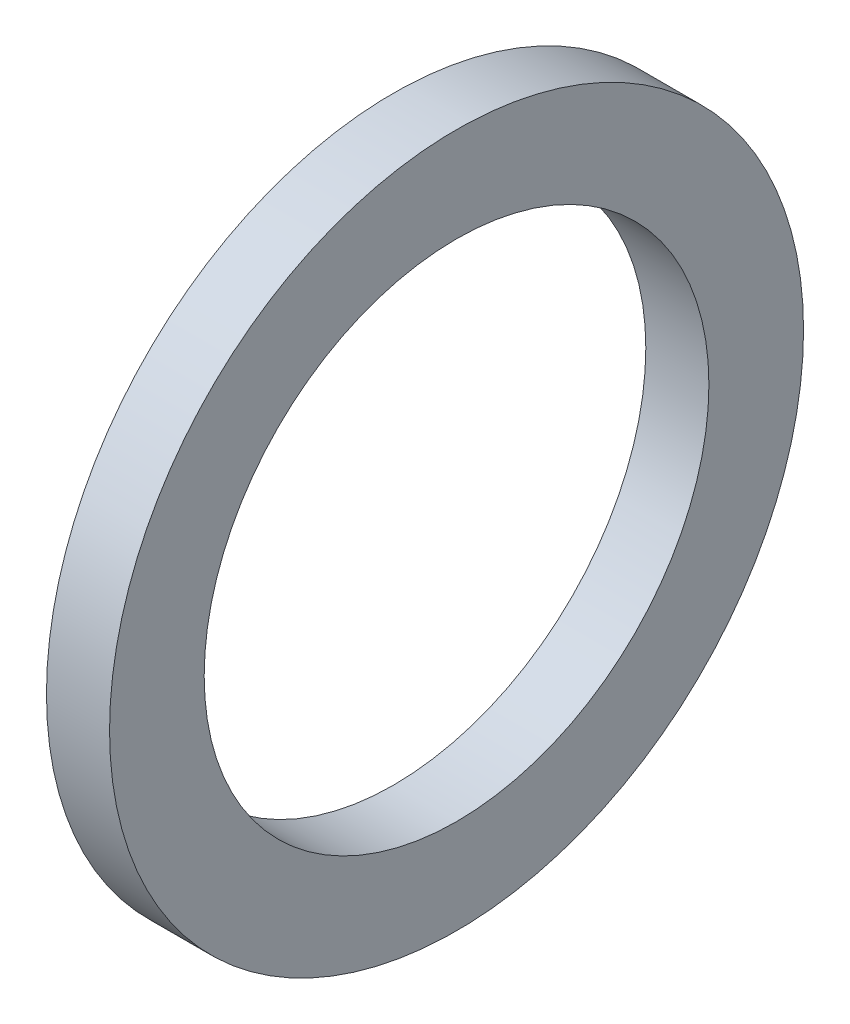
ISO-10303-21;
HEADER;
FILE_DESCRIPTION(('STEP AP214'),'2;1');
FILE_NAME('part.step','',(''),(''),'','','');
FILE_SCHEMA(('AUTOMOTIVE_DESIGN { 1 0 10303 214 1 1 1 1 }'));
ENDSEC;
DATA;
#1=APPLICATION_CONTEXT('core data for automotive mechanical design processes');
#2=APPLICATION_PROTOCOL_DEFINITION('international standard','automotive_design',2000,#1);
#3=PRODUCT_CONTEXT('',#1,'mechanical');
#4=PRODUCT('Part','Part','',(#3));
#5=PRODUCT_RELATED_PRODUCT_CATEGORY('part','',(#4));
#6=PRODUCT_DEFINITION_FORMATION('','',#4);
#7=PRODUCT_DEFINITION_CONTEXT('part definition',#1,'design');
#8=PRODUCT_DEFINITION('design','',#6,#7);
#9=PRODUCT_DEFINITION_SHAPE('','',#8);
#10=(LENGTH_UNIT() NAMED_UNIT(*) SI_UNIT(.MILLI.,.METRE.));
#11=(NAMED_UNIT(*) PLANE_ANGLE_UNIT() SI_UNIT($,.RADIAN.));
#12=(NAMED_UNIT(*) SI_UNIT($,.STERADIAN.) SOLID_ANGLE_UNIT());
#13=UNCERTAINTY_MEASURE_WITH_UNIT(LENGTH_MEASURE(1.E-05),#10,'distance_accuracy_value','');
#14=(GEOMETRIC_REPRESENTATION_CONTEXT(3) GLOBAL_UNCERTAINTY_ASSIGNED_CONTEXT((#13)) GLOBAL_UNIT_ASSIGNED_CONTEXT((#10,
#11,#12)) REPRESENTATION_CONTEXT('',''));
#15=CARTESIAN_POINT('',(0.,0.,0.));
#16=DIRECTION('',(0.,0.,1.));
#17=DIRECTION('',(1.,0.,0.));
#18=AXIS2_PLACEMENT_3D('',#15,#16,#17);
#19=CARTESIAN_POINT('',(-15.4432,0.,-221.533693244064));
#20=DIRECTION('',(-1.,0.,0.));
#21=DIRECTION('',(0.,0.,1.));
#22=AXIS2_PLACEMENT_3D('',#19,#20,#21);
#23=PLANE('',#22);
#24=CARTESIAN_POINT('',(-15.4432,0.,-221.533693244064));
#25=DIRECTION('',(-1.,0.,0.));
#26=DIRECTION('',(0.,0.,1.));
#27=AXIS2_PLACEMENT_3D('',#24,#25,#26);
#28=CIRCLE('',#27,17.4625);
#29=CARTESIAN_POINT('',(-15.4432,0.,-204.071193244064));
#30=VERTEX_POINT('',#29);
#31=EDGE_CURVE('E10',#30,#30,#28,.T.);
#32=ORIENTED_EDGE('',*,*,#31,.T.);
#33=EDGE_LOOP('',(#32));
#34=FACE_BOUND('',#33,.T.);
#35=CARTESIAN_POINT('',(-15.4432,0.,-221.533693244064));
#36=DIRECTION('',(-1.,0.,0.));
#37=DIRECTION('',(0.,0.,1.));
#38=AXIS2_PLACEMENT_3D('',#35,#36,#37);
#39=CIRCLE('',#38,12.7);
#40=CARTESIAN_POINT('',(-15.4432,0.,-208.833693244064));
#41=VERTEX_POINT('',#40);
#42=EDGE_CURVE('E48',#41,#41,#39,.T.);
#43=ORIENTED_EDGE('',*,*,#42,.F.);
#44=EDGE_LOOP('',(#43));
#45=FACE_BOUND('',#44,.T.);
#46=ADVANCED_FACE('F37',(#34,#45),#23,.T.);
#47=CARTESIAN_POINT('',(-12.2682,0.,-221.533693244064));
#48=DIRECTION('',(-1.,0.,0.));
#49=DIRECTION('',(0.,0.,1.));
#50=AXIS2_PLACEMENT_3D('',#47,#48,#49);
#51=PLANE('',#50);
#52=CARTESIAN_POINT('',(-12.2682,0.,-221.533693244064));
#53=DIRECTION('',(-1.,0.,0.));
#54=DIRECTION('',(0.,0.,1.));
#55=AXIS2_PLACEMENT_3D('',#52,#53,#54);
#56=CIRCLE('',#55,17.4625);
#57=CARTESIAN_POINT('',(-12.2682,0.,-204.071193244064));
#58=VERTEX_POINT('',#57);
#59=EDGE_CURVE('E41',#58,#58,#56,.T.);
#60=ORIENTED_EDGE('',*,*,#59,.F.);
#61=EDGE_LOOP('',(#60));
#62=FACE_BOUND('',#61,.T.);
#63=CARTESIAN_POINT('',(-12.2682,0.,-221.533693244064));
#64=DIRECTION('',(-1.,0.,0.));
#65=DIRECTION('',(0.,0.,1.));
#66=AXIS2_PLACEMENT_3D('',#63,#64,#65);
#67=CIRCLE('',#66,12.7);
#68=CARTESIAN_POINT('',(-12.2682,0.,-208.833693244064));
#69=VERTEX_POINT('',#68);
#70=EDGE_CURVE('E50',#69,#69,#67,.T.);
#71=ORIENTED_EDGE('',*,*,#70,.T.);
#72=EDGE_LOOP('',(#71));
#73=FACE_BOUND('',#72,.T.);
#74=ADVANCED_FACE('F60',(#62,#73),#51,.F.);
#75=CARTESIAN_POINT('',(-15.4432,0.,-221.533693244064));
#76=DIRECTION('',(1.,0.,0.));
#77=DIRECTION('',(0.,0.,-1.));
#78=AXIS2_PLACEMENT_3D('',#75,#76,#77);
#79=CYLINDRICAL_SURFACE('',#78,17.4625);
#80=ORIENTED_EDGE('',*,*,#31,.F.);
#81=EDGE_LOOP('',(#80));
#82=FACE_BOUND('',#81,.T.);
#83=ORIENTED_EDGE('',*,*,#59,.T.);
#84=EDGE_LOOP('',(#83));
#85=FACE_BOUND('',#84,.T.);
#86=ADVANCED_FACE('F39',(#82,#85),#79,.T.);
#87=CARTESIAN_POINT('',(-15.4432,0.,-221.533693244064));
#88=DIRECTION('',(1.,0.,0.));
#89=DIRECTION('',(0.,0.,-1.));
#90=AXIS2_PLACEMENT_3D('',#87,#88,#89);
#91=CYLINDRICAL_SURFACE('',#90,12.7);
#92=ORIENTED_EDGE('',*,*,#42,.T.);
#93=EDGE_LOOP('',(#92));
#94=FACE_BOUND('',#93,.T.);
#95=ORIENTED_EDGE('',*,*,#70,.F.);
#96=EDGE_LOOP('',(#95));
#97=FACE_BOUND('',#96,.T.);
#98=ADVANCED_FACE('F56',(#94,#97),#91,.F.);
#99=CLOSED_SHELL('',(#46,#74,#86,#98));
#100=MANIFOLD_SOLID_BREP('B2',#99);
#101=ADVANCED_BREP_SHAPE_REPRESENTATION('',(#18,#100),#14);
#102=SHAPE_DEFINITION_REPRESENTATION(#9,#101);
ENDSEC;
END-ISO-10303-21;
